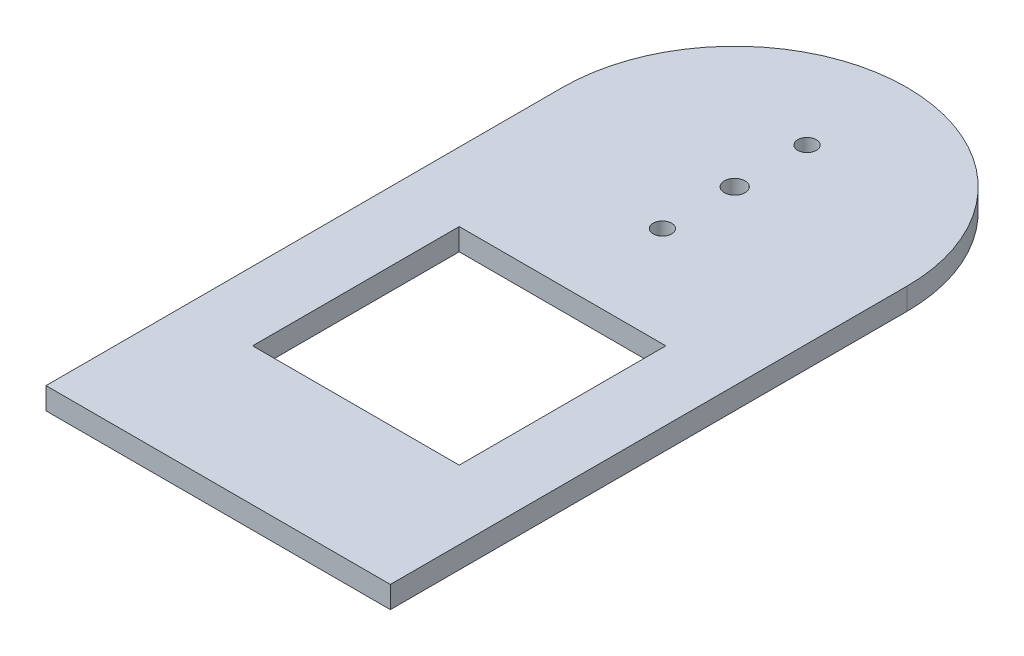
ISO-10303-21;
HEADER;
FILE_DESCRIPTION(('STEP AP214'),'2;1');
FILE_NAME('part.step','',(''),(''),'','','');
FILE_SCHEMA(('AUTOMOTIVE_DESIGN { 1 0 10303 214 1 1 1 1 }'));
ENDSEC;
DATA;
#1=APPLICATION_CONTEXT('core data for automotive mechanical design processes');
#2=APPLICATION_PROTOCOL_DEFINITION('international standard','automotive_design',2000,#1);
#3=PRODUCT_CONTEXT('',#1,'mechanical');
#4=PRODUCT('Part','Part','',(#3));
#5=PRODUCT_RELATED_PRODUCT_CATEGORY('part','',(#4));
#6=PRODUCT_DEFINITION_FORMATION('','',#4);
#7=PRODUCT_DEFINITION_CONTEXT('part definition',#1,'design');
#8=PRODUCT_DEFINITION('design','',#6,#7);
#9=PRODUCT_DEFINITION_SHAPE('','',#8);
#10=(LENGTH_UNIT() NAMED_UNIT(*) SI_UNIT(.MILLI.,.METRE.));
#11=(NAMED_UNIT(*) PLANE_ANGLE_UNIT() SI_UNIT($,.RADIAN.));
#12=(NAMED_UNIT(*) SI_UNIT($,.STERADIAN.) SOLID_ANGLE_UNIT());
#13=UNCERTAINTY_MEASURE_WITH_UNIT(LENGTH_MEASURE(1.E-05),#10,'distance_accuracy_value','');
#14=(GEOMETRIC_REPRESENTATION_CONTEXT(3) GLOBAL_UNCERTAINTY_ASSIGNED_CONTEXT((#13)) GLOBAL_UNIT_ASSIGNED_CONTEXT((#10,
#11,#12)) REPRESENTATION_CONTEXT('',''));
#15=CARTESIAN_POINT('',(0.,0.,0.));
#16=DIRECTION('',(0.,0.,1.));
#17=DIRECTION('',(1.,0.,0.));
#18=AXIS2_PLACEMENT_3D('',#15,#16,#17);
#19=CARTESIAN_POINT('',(0.,3.175,0.));
#20=DIRECTION('',(0.,1.,0.));
#21=DIRECTION('',(0.,0.,1.));
#22=AXIS2_PLACEMENT_3D('',#19,#20,#21);
#23=PLANE('',#22);
#24=CARTESIAN_POINT('',(25.,3.175,35.5));
#25=DIRECTION('',(0.,1.,0.));
#26=DIRECTION('',(0.,0.,1.));
#27=AXIS2_PLACEMENT_3D('',#24,#25,#26);
#28=CIRCLE('',#27,1.35);
#29=CARTESIAN_POINT('',(25.,3.175,36.85));
#30=VERTEX_POINT('',#29);
#31=EDGE_CURVE('E154',#30,#30,#28,.T.);
#32=ORIENTED_EDGE('',*,*,#31,.F.);
#33=EDGE_LOOP('',(#32));
#34=FACE_BOUND('',#33,.T.);
#35=CARTESIAN_POINT('',(25.,3.175,25.));
#36=DIRECTION('',(0.,1.,0.));
#37=DIRECTION('',(0.,0.,1.));
#38=AXIS2_PLACEMENT_3D('',#35,#36,#37);
#39=CIRCLE('',#38,1.5);
#40=CARTESIAN_POINT('',(25.,3.175,26.5));
#41=VERTEX_POINT('',#40);
#42=EDGE_CURVE('E148',#41,#41,#39,.T.);
#43=ORIENTED_EDGE('',*,*,#42,.F.);
#44=EDGE_LOOP('',(#43));
#45=FACE_BOUND('',#44,.T.);
#46=CARTESIAN_POINT('',(25.,3.175,14.5));
#47=DIRECTION('',(0.,1.,0.));
#48=DIRECTION('',(0.,0.,-1.));
#49=AXIS2_PLACEMENT_3D('',#46,#47,#48);
#50=CIRCLE('',#49,1.35);
#51=CARTESIAN_POINT('',(25.,3.175,13.15));
#52=VERTEX_POINT('',#51);
#53=EDGE_CURVE('E160',#52,#52,#50,.T.);
#54=ORIENTED_EDGE('',*,*,#53,.F.);
#55=EDGE_LOOP('',(#54));
#56=FACE_BOUND('',#55,.T.);
#57=DIRECTION('',(1.,0.,0.));
#58=VECTOR('',#57,1.);
#59=CARTESIAN_POINT('',(10.,3.175,80.));
#60=LINE('',#59,#58);
#61=CARTESIAN_POINT('',(10.,3.175,80.));
#62=VERTEX_POINT('',#61);
#63=CARTESIAN_POINT('',(40.,3.175,80.));
#64=VERTEX_POINT('',#63);
#65=EDGE_CURVE('E191',#62,#64,#60,.T.);
#66=ORIENTED_EDGE('',*,*,#65,.F.);
#67=DIRECTION('',(0.,0.,1.));
#68=VECTOR('',#67,1.);
#69=CARTESIAN_POINT('',(10.,3.175,50.));
#70=LINE('',#69,#68);
#71=CARTESIAN_POINT('',(10.,3.175,50.));
#72=VERTEX_POINT('',#71);
#73=EDGE_CURVE('E179',#72,#62,#70,.T.);
#74=ORIENTED_EDGE('',*,*,#73,.F.);
#75=DIRECTION('',(-1.,0.,0.));
#76=VECTOR('',#75,1.);
#77=CARTESIAN_POINT('',(10.,3.175,50.));
#78=LINE('',#77,#76);
#79=CARTESIAN_POINT('',(40.,3.175,50.));
#80=VERTEX_POINT('',#79);
#81=EDGE_CURVE('E175',#80,#72,#78,.T.);
#82=ORIENTED_EDGE('',*,*,#81,.F.);
#83=DIRECTION('',(0.,0.,-1.));
#84=VECTOR('',#83,1.);
#85=CARTESIAN_POINT('',(40.,3.175,50.));
#86=LINE('',#85,#84);
#87=EDGE_CURVE('E189',#64,#80,#86,.T.);
#88=ORIENTED_EDGE('',*,*,#87,.F.);
#89=EDGE_LOOP('',(#66,#74,#82,#88));
#90=FACE_BOUND('',#89,.T.);
#91=DIRECTION('',(0.,0.,-1.));
#92=VECTOR('',#91,1.);
#93=CARTESIAN_POINT('',(50.,3.175,0.));
#94=LINE('',#93,#92);
#95=CARTESIAN_POINT('',(50.,3.175,100.));
#96=VERTEX_POINT('',#95);
#97=CARTESIAN_POINT('',(50.,3.175,25.));
#98=VERTEX_POINT('',#97);
#99=EDGE_CURVE('E133',#96,#98,#94,.T.);
#100=ORIENTED_EDGE('',*,*,#99,.T.);
#101=CARTESIAN_POINT('',(25.,3.175,25.));
#102=DIRECTION('',(0.,1.,0.));
#103=DIRECTION('',(0.,0.,1.));
#104=AXIS2_PLACEMENT_3D('',#101,#102,#103);
#105=CIRCLE('',#104,25.);
#106=CARTESIAN_POINT('',(0.,3.175,25.));
#107=VERTEX_POINT('',#106);
#108=EDGE_CURVE('E118',#98,#107,#105,.T.);
#109=ORIENTED_EDGE('',*,*,#108,.T.);
#110=DIRECTION('',(0.,0.,1.));
#111=VECTOR('',#110,1.);
#112=CARTESIAN_POINT('',(0.,3.175,0.));
#113=LINE('',#112,#111);
#114=CARTESIAN_POINT('',(0.,3.175,100.));
#115=VERTEX_POINT('',#114);
#116=EDGE_CURVE('E141',#107,#115,#113,.T.);
#117=ORIENTED_EDGE('',*,*,#116,.T.);
#118=DIRECTION('',(1.,0.,0.));
#119=VECTOR('',#118,1.);
#120=CARTESIAN_POINT('',(0.,3.175,100.));
#121=LINE('',#120,#119);
#122=EDGE_CURVE('E138',#115,#96,#121,.T.);
#123=ORIENTED_EDGE('',*,*,#122,.T.);
#124=EDGE_LOOP('',(#100,#109,#117,#123));
#125=FACE_BOUND('',#124,.T.);
#126=ADVANCED_FACE('F51',(#34,#45,#56,#90,#125),#23,.T.);
#127=CARTESIAN_POINT('',(0.,0.,0.));
#128=DIRECTION('',(0.,1.,0.));
#129=DIRECTION('',(0.,0.,1.));
#130=AXIS2_PLACEMENT_3D('',#127,#128,#129);
#131=PLANE('',#130);
#132=CARTESIAN_POINT('',(25.,0.,14.5));
#133=DIRECTION('',(0.,1.,0.));
#134=DIRECTION('',(0.,0.,-1.));
#135=AXIS2_PLACEMENT_3D('',#132,#133,#134);
#136=CIRCLE('',#135,1.35);
#137=CARTESIAN_POINT('',(25.,0.,13.15));
#138=VERTEX_POINT('',#137);
#139=EDGE_CURVE('E163',#138,#138,#136,.T.);
#140=ORIENTED_EDGE('',*,*,#139,.T.);
#141=EDGE_LOOP('',(#140));
#142=FACE_BOUND('',#141,.T.);
#143=CARTESIAN_POINT('',(25.,0.,35.5));
#144=DIRECTION('',(0.,1.,0.));
#145=DIRECTION('',(0.,0.,1.));
#146=AXIS2_PLACEMENT_3D('',#143,#144,#145);
#147=CIRCLE('',#146,1.35);
#148=CARTESIAN_POINT('',(25.,0.,36.85));
#149=VERTEX_POINT('',#148);
#150=EDGE_CURVE('E157',#149,#149,#147,.T.);
#151=ORIENTED_EDGE('',*,*,#150,.T.);
#152=EDGE_LOOP('',(#151));
#153=FACE_BOUND('',#152,.T.);
#154=CARTESIAN_POINT('',(25.,0.,25.));
#155=DIRECTION('',(0.,1.,0.));
#156=DIRECTION('',(0.,0.,1.));
#157=AXIS2_PLACEMENT_3D('',#154,#155,#156);
#158=CIRCLE('',#157,1.5);
#159=CARTESIAN_POINT('',(25.,0.,26.5));
#160=VERTEX_POINT('',#159);
#161=EDGE_CURVE('E151',#160,#160,#158,.T.);
#162=ORIENTED_EDGE('',*,*,#161,.T.);
#163=EDGE_LOOP('',(#162));
#164=FACE_BOUND('',#163,.T.);
#165=DIRECTION('',(0.,0.,1.));
#166=VECTOR('',#165,1.);
#167=CARTESIAN_POINT('',(10.,0.,50.));
#168=LINE('',#167,#166);
#169=CARTESIAN_POINT('',(10.,0.,50.));
#170=VERTEX_POINT('',#169);
#171=CARTESIAN_POINT('',(10.,0.,80.));
#172=VERTEX_POINT('',#171);
#173=EDGE_CURVE('E74',#170,#172,#168,.T.);
#174=ORIENTED_EDGE('',*,*,#173,.T.);
#175=DIRECTION('',(1.,0.,0.));
#176=VECTOR('',#175,1.);
#177=CARTESIAN_POINT('',(10.,0.,80.));
#178=LINE('',#177,#176);
#179=CARTESIAN_POINT('',(40.,0.,80.));
#180=VERTEX_POINT('',#179);
#181=EDGE_CURVE('E183',#172,#180,#178,.T.);
#182=ORIENTED_EDGE('',*,*,#181,.T.);
#183=DIRECTION('',(0.,0.,-1.));
#184=VECTOR('',#183,1.);
#185=CARTESIAN_POINT('',(40.,0.,50.));
#186=LINE('',#185,#184);
#187=CARTESIAN_POINT('',(40.,0.,50.));
#188=VERTEX_POINT('',#187);
#189=EDGE_CURVE('E180',#180,#188,#186,.T.);
#190=ORIENTED_EDGE('',*,*,#189,.T.);
#191=DIRECTION('',(-1.,0.,0.));
#192=VECTOR('',#191,1.);
#193=CARTESIAN_POINT('',(10.,0.,50.));
#194=LINE('',#193,#192);
#195=EDGE_CURVE('E176',#188,#170,#194,.T.);
#196=ORIENTED_EDGE('',*,*,#195,.T.);
#197=EDGE_LOOP('',(#174,#182,#190,#196));
#198=FACE_BOUND('',#197,.T.);
#199=CARTESIAN_POINT('',(25.,0.,25.));
#200=DIRECTION('',(0.,1.,0.));
#201=DIRECTION('',(0.,0.,1.));
#202=AXIS2_PLACEMENT_3D('',#199,#200,#201);
#203=CIRCLE('',#202,25.);
#204=CARTESIAN_POINT('',(50.,0.,25.));
#205=VERTEX_POINT('',#204);
#206=CARTESIAN_POINT('',(0.,0.,25.));
#207=VERTEX_POINT('',#206);
#208=EDGE_CURVE('E187',#205,#207,#203,.T.);
#209=ORIENTED_EDGE('',*,*,#208,.F.);
#210=DIRECTION('',(0.,0.,-1.));
#211=VECTOR('',#210,1.);
#212=CARTESIAN_POINT('',(50.,0.,0.));
#213=LINE('',#212,#211);
#214=CARTESIAN_POINT('',(50.,0.,100.));
#215=VERTEX_POINT('',#214);
#216=EDGE_CURVE('E135',#215,#205,#213,.T.);
#217=ORIENTED_EDGE('',*,*,#216,.F.);
#218=DIRECTION('',(1.,0.,0.));
#219=VECTOR('',#218,1.);
#220=CARTESIAN_POINT('',(0.,0.,100.));
#221=LINE('',#220,#219);
#222=CARTESIAN_POINT('',(0.,0.,100.));
#223=VERTEX_POINT('',#222);
#224=EDGE_CURVE('E147',#223,#215,#221,.T.);
#225=ORIENTED_EDGE('',*,*,#224,.F.);
#226=DIRECTION('',(0.,0.,1.));
#227=VECTOR('',#226,1.);
#228=CARTESIAN_POINT('',(0.,0.,0.));
#229=LINE('',#228,#227);
#230=EDGE_CURVE('E145',#207,#223,#229,.T.);
#231=ORIENTED_EDGE('',*,*,#230,.F.);
#232=EDGE_LOOP('',(#209,#217,#225,#231));
#233=FACE_BOUND('',#232,.T.);
#234=ADVANCED_FACE('F200',(#142,#153,#164,#198,#233),#131,.F.);
#235=CARTESIAN_POINT('',(0.,3.175,0.));
#236=DIRECTION('',(1.,0.,0.));
#237=DIRECTION('',(0.,0.,-1.));
#238=AXIS2_PLACEMENT_3D('',#235,#236,#237);
#239=PLANE('',#238);
#240=DIRECTION('',(0.,1.,0.));
#241=VECTOR('',#240,1.);
#242=CARTESIAN_POINT('',(0.,-3.175,25.));
#243=LINE('',#242,#241);
#244=EDGE_CURVE('E124',#207,#107,#243,.T.);
#245=ORIENTED_EDGE('',*,*,#244,.F.);
#246=ORIENTED_EDGE('',*,*,#230,.T.);
#247=DIRECTION('',(0.,-1.,0.));
#248=VECTOR('',#247,1.);
#249=CARTESIAN_POINT('',(0.,3.175,100.));
#250=LINE('',#249,#248);
#251=EDGE_CURVE('E12',#115,#223,#250,.T.);
#252=ORIENTED_EDGE('',*,*,#251,.F.);
#253=ORIENTED_EDGE('',*,*,#116,.F.);
#254=EDGE_LOOP('',(#245,#246,#252,#253));
#255=FACE_BOUND('',#254,.T.);
#256=ADVANCED_FACE('F53',(#255),#239,.F.);
#257=CARTESIAN_POINT('',(0.,3.175,100.));
#258=DIRECTION('',(0.,0.,-1.));
#259=DIRECTION('',(-1.,0.,0.));
#260=AXIS2_PLACEMENT_3D('',#257,#258,#259);
#261=PLANE('',#260);
#262=ORIENTED_EDGE('',*,*,#224,.T.);
#263=DIRECTION('',(0.,-1.,0.));
#264=VECTOR('',#263,1.);
#265=CARTESIAN_POINT('',(50.,3.175,100.));
#266=LINE('',#265,#264);
#267=EDGE_CURVE('E59',#96,#215,#266,.T.);
#268=ORIENTED_EDGE('',*,*,#267,.F.);
#269=ORIENTED_EDGE('',*,*,#122,.F.);
#270=ORIENTED_EDGE('',*,*,#251,.T.);
#271=EDGE_LOOP('',(#262,#268,#269,#270));
#272=FACE_BOUND('',#271,.T.);
#273=ADVANCED_FACE('F202',(#272),#261,.F.);
#274=CARTESIAN_POINT('',(50.,3.175,0.));
#275=DIRECTION('',(-1.,0.,0.));
#276=DIRECTION('',(0.,0.,1.));
#277=AXIS2_PLACEMENT_3D('',#274,#275,#276);
#278=PLANE('',#277);
#279=ORIENTED_EDGE('',*,*,#216,.T.);
#280=DIRECTION('',(0.,1.,0.));
#281=VECTOR('',#280,1.);
#282=CARTESIAN_POINT('',(50.,-3.175,25.));
#283=LINE('',#282,#281);
#284=EDGE_CURVE('E121',#205,#98,#283,.T.);
#285=ORIENTED_EDGE('',*,*,#284,.T.);
#286=ORIENTED_EDGE('',*,*,#99,.F.);
#287=ORIENTED_EDGE('',*,*,#267,.T.);
#288=EDGE_LOOP('',(#279,#285,#286,#287));
#289=FACE_BOUND('',#288,.T.);
#290=ADVANCED_FACE('F131',(#289),#278,.F.);
#291=CARTESIAN_POINT('',(25.,3.175,25.));
#292=DIRECTION('',(0.,-1.,0.));
#293=DIRECTION('',(0.,0.,-1.));
#294=AXIS2_PLACEMENT_3D('',#291,#292,#293);
#295=CYLINDRICAL_SURFACE('',#294,1.5);
#296=ORIENTED_EDGE('',*,*,#42,.T.);
#297=EDGE_LOOP('',(#296));
#298=FACE_BOUND('',#297,.T.);
#299=ORIENTED_EDGE('',*,*,#161,.F.);
#300=EDGE_LOOP('',(#299));
#301=FACE_BOUND('',#300,.T.);
#302=ADVANCED_FACE('F208',(#298,#301),#295,.F.);
#303=CARTESIAN_POINT('',(25.,3.175,35.5));
#304=DIRECTION('',(0.,-1.,0.));
#305=DIRECTION('',(0.,0.,-1.));
#306=AXIS2_PLACEMENT_3D('',#303,#304,#305);
#307=CYLINDRICAL_SURFACE('',#306,1.35);
#308=ORIENTED_EDGE('',*,*,#31,.T.);
#309=EDGE_LOOP('',(#308));
#310=FACE_BOUND('',#309,.T.);
#311=ORIENTED_EDGE('',*,*,#150,.F.);
#312=EDGE_LOOP('',(#311));
#313=FACE_BOUND('',#312,.T.);
#314=ADVANCED_FACE('F223',(#310,#313),#307,.F.);
#315=CARTESIAN_POINT('',(25.,3.175,14.5));
#316=DIRECTION('',(0.,-1.,0.));
#317=DIRECTION('',(0.,0.,-1.));
#318=AXIS2_PLACEMENT_3D('',#315,#316,#317);
#319=CYLINDRICAL_SURFACE('',#318,1.35);
#320=ORIENTED_EDGE('',*,*,#53,.T.);
#321=EDGE_LOOP('',(#320));
#322=FACE_BOUND('',#321,.T.);
#323=ORIENTED_EDGE('',*,*,#139,.F.);
#324=EDGE_LOOP('',(#323));
#325=FACE_BOUND('',#324,.T.);
#326=ADVANCED_FACE('F227',(#322,#325),#319,.F.);
#327=CARTESIAN_POINT('',(10.,3.175,50.));
#328=DIRECTION('',(1.,0.,0.));
#329=DIRECTION('',(0.,0.,-1.));
#330=AXIS2_PLACEMENT_3D('',#327,#328,#329);
#331=PLANE('',#330);
#332=ORIENTED_EDGE('',*,*,#173,.F.);
#333=DIRECTION('',(0.,-1.,0.));
#334=VECTOR('',#333,1.);
#335=CARTESIAN_POINT('',(10.,3.175,50.));
#336=LINE('',#335,#334);
#337=EDGE_CURVE('E173',#72,#170,#336,.T.);
#338=ORIENTED_EDGE('',*,*,#337,.F.);
#339=ORIENTED_EDGE('',*,*,#73,.T.);
#340=DIRECTION('',(0.,-1.,0.));
#341=VECTOR('',#340,1.);
#342=CARTESIAN_POINT('',(10.,3.175,80.));
#343=LINE('',#342,#341);
#344=EDGE_CURVE('E166',#62,#172,#343,.T.);
#345=ORIENTED_EDGE('',*,*,#344,.T.);
#346=EDGE_LOOP('',(#332,#338,#339,#345));
#347=FACE_BOUND('',#346,.T.);
#348=ADVANCED_FACE('F231',(#347),#331,.T.);
#349=CARTESIAN_POINT('',(10.,3.175,80.));
#350=DIRECTION('',(0.,0.,-1.));
#351=DIRECTION('',(-1.,0.,0.));
#352=AXIS2_PLACEMENT_3D('',#349,#350,#351);
#353=PLANE('',#352);
#354=ORIENTED_EDGE('',*,*,#181,.F.);
#355=ORIENTED_EDGE('',*,*,#344,.F.);
#356=ORIENTED_EDGE('',*,*,#65,.T.);
#357=DIRECTION('',(0.,-1.,0.));
#358=VECTOR('',#357,1.);
#359=CARTESIAN_POINT('',(40.,3.175,80.));
#360=LINE('',#359,#358);
#361=EDGE_CURVE('E170',#64,#180,#360,.T.);
#362=ORIENTED_EDGE('',*,*,#361,.T.);
#363=EDGE_LOOP('',(#354,#355,#356,#362));
#364=FACE_BOUND('',#363,.T.);
#365=ADVANCED_FACE('F235',(#364),#353,.T.);
#366=CARTESIAN_POINT('',(40.,3.175,50.));
#367=DIRECTION('',(-1.,0.,0.));
#368=DIRECTION('',(0.,0.,1.));
#369=AXIS2_PLACEMENT_3D('',#366,#367,#368);
#370=PLANE('',#369);
#371=ORIENTED_EDGE('',*,*,#189,.F.);
#372=ORIENTED_EDGE('',*,*,#361,.F.);
#373=ORIENTED_EDGE('',*,*,#87,.T.);
#374=DIRECTION('',(0.,-1.,0.));
#375=VECTOR('',#374,1.);
#376=CARTESIAN_POINT('',(40.,3.175,50.));
#377=LINE('',#376,#375);
#378=EDGE_CURVE('E66',#80,#188,#377,.T.);
#379=ORIENTED_EDGE('',*,*,#378,.T.);
#380=EDGE_LOOP('',(#371,#372,#373,#379));
#381=FACE_BOUND('',#380,.T.);
#382=ADVANCED_FACE('F238',(#381),#370,.T.);
#383=CARTESIAN_POINT('',(10.,3.175,50.));
#384=DIRECTION('',(0.,0.,1.));
#385=DIRECTION('',(1.,0.,0.));
#386=AXIS2_PLACEMENT_3D('',#383,#384,#385);
#387=PLANE('',#386);
#388=ORIENTED_EDGE('',*,*,#195,.F.);
#389=ORIENTED_EDGE('',*,*,#378,.F.);
#390=ORIENTED_EDGE('',*,*,#81,.T.);
#391=ORIENTED_EDGE('',*,*,#337,.T.);
#392=EDGE_LOOP('',(#388,#389,#390,#391));
#393=FACE_BOUND('',#392,.T.);
#394=ADVANCED_FACE('F242',(#393),#387,.T.);
#395=CARTESIAN_POINT('',(25.,-3.175,25.));
#396=DIRECTION('',(0.,1.,0.));
#397=DIRECTION('',(0.,0.,1.));
#398=AXIS2_PLACEMENT_3D('',#395,#396,#397);
#399=CYLINDRICAL_SURFACE('',#398,25.);
#400=ORIENTED_EDGE('',*,*,#208,.T.);
#401=ORIENTED_EDGE('',*,*,#244,.T.);
#402=ORIENTED_EDGE('',*,*,#108,.F.);
#403=ORIENTED_EDGE('',*,*,#284,.F.);
#404=EDGE_LOOP('',(#400,#401,#402,#403));
#405=FACE_BOUND('',#404,.T.);
#406=ADVANCED_FACE('F120',(#405),#399,.T.);
#407=CLOSED_SHELL('',(#126,#234,#256,#273,#290,#302,#314,#326,#348,#365,#382,#394,#406));
#408=MANIFOLD_SOLID_BREP('B2',#407);
#409=ADVANCED_BREP_SHAPE_REPRESENTATION('',(#18,#408),#14);
#410=SHAPE_DEFINITION_REPRESENTATION(#9,#409);
ENDSEC;
END-ISO-10303-21;
